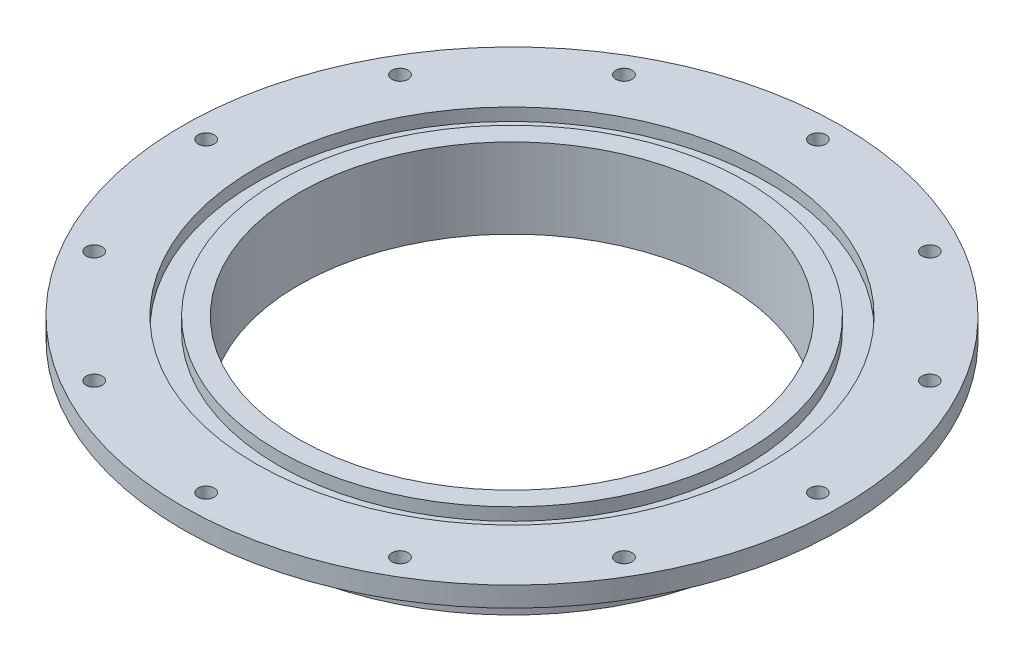
ISO-10303-21;
HEADER;
FILE_DESCRIPTION(('STEP AP214'),'2;1');
FILE_NAME('part.step','',(''),(''),'','','');
FILE_SCHEMA(('AUTOMOTIVE_DESIGN { 1 0 10303 214 1 1 1 1 }'));
ENDSEC;
DATA;
#1=APPLICATION_CONTEXT('core data for automotive mechanical design processes');
#2=APPLICATION_PROTOCOL_DEFINITION('international standard','automotive_design',2000,#1);
#3=PRODUCT_CONTEXT('',#1,'mechanical');
#4=PRODUCT('Part','Part','',(#3));
#5=PRODUCT_RELATED_PRODUCT_CATEGORY('part','',(#4));
#6=PRODUCT_DEFINITION_FORMATION('','',#4);
#7=PRODUCT_DEFINITION_CONTEXT('part definition',#1,'design');
#8=PRODUCT_DEFINITION('design','',#6,#7);
#9=PRODUCT_DEFINITION_SHAPE('','',#8);
#10=(LENGTH_UNIT() NAMED_UNIT(*) SI_UNIT(.MILLI.,.METRE.));
#11=(NAMED_UNIT(*) PLANE_ANGLE_UNIT() SI_UNIT($,.RADIAN.));
#12=(NAMED_UNIT(*) SI_UNIT($,.STERADIAN.) SOLID_ANGLE_UNIT());
#13=UNCERTAINTY_MEASURE_WITH_UNIT(LENGTH_MEASURE(1.E-05),#10,'distance_accuracy_value','');
#14=(GEOMETRIC_REPRESENTATION_CONTEXT(3) GLOBAL_UNCERTAINTY_ASSIGNED_CONTEXT((#13)) GLOBAL_UNIT_ASSIGNED_CONTEXT((#10,
#11,#12)) REPRESENTATION_CONTEXT('',''));
#15=CARTESIAN_POINT('',(0.,0.,0.));
#16=DIRECTION('',(0.,0.,1.));
#17=DIRECTION('',(1.,0.,0.));
#18=AXIS2_PLACEMENT_3D('',#15,#16,#17);
#19=CARTESIAN_POINT('',(0.,19.05,0.));
#20=DIRECTION('',(0.,-1.,0.));
#21=DIRECTION('',(0.,0.,-1.));
#22=AXIS2_PLACEMENT_3D('',#19,#20,#21);
#23=CYLINDRICAL_SURFACE('',#22,80.518);
#24=CARTESIAN_POINT('',(0.,19.05,0.));
#25=DIRECTION('',(0.,1.,0.));
#26=DIRECTION('',(0.,0.,1.));
#27=AXIS2_PLACEMENT_3D('',#24,#25,#26);
#28=CIRCLE('',#27,80.518);
#29=CARTESIAN_POINT('',(0.,19.05,-80.518));
#30=VERTEX_POINT('',#29);
#31=EDGE_CURVE('E10',#30,#30,#28,.T.);
#32=CARTESIAN_POINT('',(0.,13.1318,0.));
#33=DIRECTION('',(0.,-1.,0.));
#34=DIRECTION('',(0.,0.,-1.));
#35=AXIS2_PLACEMENT_3D('',#32,#33,#34);
#36=CIRCLE('',#35,80.518);
#37=CARTESIAN_POINT('',(0.,13.1318,-80.518));
#38=VERTEX_POINT('',#37);
#39=EDGE_CURVE('E189',#38,#38,#36,.T.);
#40=CARTESIAN_POINT('',(0.,19.05,-80.518));
#41=CARTESIAN_POINT('',(0.,18.9883520833333,-80.518));
#42=CARTESIAN_POINT('',(0.,18.9267041666667,-80.518));
#43=CARTESIAN_POINT('',(0.,18.8034083333333,-80.518));
#44=CARTESIAN_POINT('',(0.,18.7417604166667,-80.518));
#45=CARTESIAN_POINT('',(0.,18.6184645833333,-80.518));
#46=CARTESIAN_POINT('',(0.,18.5568166666667,-80.518));
#47=CARTESIAN_POINT('',(0.,18.4335208333333,-80.518));
#48=CARTESIAN_POINT('',(0.,18.3718729166667,-80.518));
#49=CARTESIAN_POINT('',(0.,18.2485770833333,-80.518));
#50=CARTESIAN_POINT('',(0.,18.1869291666667,-80.518));
#51=CARTESIAN_POINT('',(0.,18.0636333333333,-80.518));
#52=CARTESIAN_POINT('',(0.,18.0019854166667,-80.518));
#53=CARTESIAN_POINT('',(0.,17.8786895833333,-80.518));
#54=CARTESIAN_POINT('',(0.,17.8170416666667,-80.518));
#55=CARTESIAN_POINT('',(0.,17.6937458333333,-80.518));
#56=CARTESIAN_POINT('',(0.,17.6320979166667,-80.518));
#57=CARTESIAN_POINT('',(0.,17.5088020833333,-80.518));
#58=CARTESIAN_POINT('',(0.,17.4471541666667,-80.518));
#59=CARTESIAN_POINT('',(0.,17.3238583333333,-80.518));
#60=CARTESIAN_POINT('',(0.,17.2622104166667,-80.518));
#61=CARTESIAN_POINT('',(0.,17.1389145833333,-80.518));
#62=CARTESIAN_POINT('',(0.,17.0772666666667,-80.518));
#63=CARTESIAN_POINT('',(0.,16.9539708333333,-80.518));
#64=CARTESIAN_POINT('',(0.,16.8923229166667,-80.518));
#65=CARTESIAN_POINT('',(0.,16.7690270833333,-80.518));
#66=CARTESIAN_POINT('',(0.,16.7073791666667,-80.518));
#67=CARTESIAN_POINT('',(0.,16.5840833333333,-80.518));
#68=CARTESIAN_POINT('',(0.,16.5224354166667,-80.518));
#69=CARTESIAN_POINT('',(0.,16.3991395833333,-80.518));
#70=CARTESIAN_POINT('',(0.,16.3374916666667,-80.518));
#71=CARTESIAN_POINT('',(0.,16.2141958333333,-80.518));
#72=CARTESIAN_POINT('',(0.,16.1525479166667,-80.518));
#73=CARTESIAN_POINT('',(0.,16.0292520833333,-80.518));
#74=CARTESIAN_POINT('',(0.,15.9676041666667,-80.518));
#75=CARTESIAN_POINT('',(0.,15.8443083333333,-80.518));
#76=CARTESIAN_POINT('',(0.,15.7826604166667,-80.518));
#77=CARTESIAN_POINT('',(0.,15.6593645833333,-80.518));
#78=CARTESIAN_POINT('',(0.,15.5977166666667,-80.518));
#79=CARTESIAN_POINT('',(0.,15.4744208333333,-80.518));
#80=CARTESIAN_POINT('',(0.,15.4127729166667,-80.518));
#81=CARTESIAN_POINT('',(0.,15.2894770833333,-80.518));
#82=CARTESIAN_POINT('',(0.,15.2278291666667,-80.518));
#83=CARTESIAN_POINT('',(0.,15.1045333333333,-80.518));
#84=CARTESIAN_POINT('',(0.,15.0428854166667,-80.518));
#85=CARTESIAN_POINT('',(0.,14.9195895833333,-80.518));
#86=CARTESIAN_POINT('',(0.,14.8579416666667,-80.518));
#87=CARTESIAN_POINT('',(0.,14.7346458333333,-80.518));
#88=CARTESIAN_POINT('',(0.,14.6729979166667,-80.518));
#89=CARTESIAN_POINT('',(0.,14.5497020833333,-80.518));
#90=CARTESIAN_POINT('',(0.,14.4880541666667,-80.518));
#91=CARTESIAN_POINT('',(0.,14.3647583333333,-80.518));
#92=CARTESIAN_POINT('',(0.,14.3031104166667,-80.518));
#93=CARTESIAN_POINT('',(0.,14.1798145833333,-80.518));
#94=CARTESIAN_POINT('',(0.,14.1181666666667,-80.518));
#95=CARTESIAN_POINT('',(0.,13.9948708333333,-80.518));
#96=CARTESIAN_POINT('',(0.,13.9332229166667,-80.518));
#97=CARTESIAN_POINT('',(0.,13.8099270833333,-80.518));
#98=CARTESIAN_POINT('',(0.,13.7482791666667,-80.518));
#99=CARTESIAN_POINT('',(0.,13.6249833333333,-80.518));
#100=CARTESIAN_POINT('',(0.,13.5633354166667,-80.518));
#101=CARTESIAN_POINT('',(0.,13.4400395833333,-80.518));
#102=CARTESIAN_POINT('',(0.,13.3783916666667,-80.518));
#103=CARTESIAN_POINT('',(0.,13.2550958333333,-80.518));
#104=CARTESIAN_POINT('',(0.,13.1934479166667,-80.518));
#105=CARTESIAN_POINT('',(0.,13.1318,-80.518));
#106=B_SPLINE_CURVE_WITH_KNOTS('',3,(#40,#41,#42,#43,#44,#45,#46,#47,#48,#49,#50,#51,#52,#53,
#54,#55,#56,#57,#58,#59,#60,#61,#62,#63,#64,#65,#66,#67,#68,#69,#70,#71,#72,#73,#74,#75,#76,#77,
#78,#79,#80,#81,#82,#83,#84,#85,#86,#87,#88,#89,#90,#91,#92,#93,#94,#95,#96,#97,#98,#99,#100,
#101,#102,#103,#104,#105),.UNSPECIFIED.,.F.,.F.,(4,2,2,2,2,2,2,2,2,2,2,2,2,2,2,2,2,2,2,2,2,2,2,
2,2,2,2,2,2,2,2,2,4),(0.,0.184943750000003,0.369887500000002,0.554831250000002,
0.739775000000002,0.924718750000001,1.1096625,1.29460625,1.47955,1.66449375,1.8494375,
2.03438125,2.219325,2.40426875,2.5892125,2.77415625,2.9591,3.14404375,3.3289875,3.51393125,
3.698875,3.88381875,4.0687625,4.25370625,4.43865,4.62359375,4.8085375,4.99348125,5.178425,
5.36336875,5.5483125,5.73325625,5.9182),.UNSPECIFIED.);
#107=EDGE_CURVE('BSEAM39',#30,#38,#106,.T.);
#108=ORIENTED_EDGE('',*,*,#31,.F.);
#109=ORIENTED_EDGE('',*,*,#39,.F.);
#110=ORIENTED_EDGE('',*,*,#107,.T.);
#111=ORIENTED_EDGE('',*,*,#107,.F.);
#112=EDGE_LOOP('',(#108,#110,#109,#111));
#113=FACE_BOUND('',#112,.T.);
#114=ADVANCED_FACE('F39',(#113),#23,.T.);
#115=CARTESIAN_POINT('',(0.,25.4,0.));
#116=DIRECTION('',(0.,1.,0.));
#117=DIRECTION('',(0.,0.,1.));
#118=AXIS2_PLACEMENT_3D('',#115,#116,#117);
#119=PLANE('',#118);
#120=CARTESIAN_POINT('',(0.,25.4,0.));
#121=DIRECTION('',(0.,1.,0.));
#122=DIRECTION('',(0.,0.,1.));
#123=AXIS2_PLACEMENT_3D('',#120,#121,#122);
#124=CIRCLE('',#123,67.818);
#125=CARTESIAN_POINT('',(0.,25.4,-67.818));
#126=VERTEX_POINT('',#125);
#127=EDGE_CURVE('E62',#126,#126,#124,.T.);
#128=ORIENTED_EDGE('',*,*,#127,.F.);
#129=EDGE_LOOP('',(#128));
#130=FACE_BOUND('',#129,.T.);
#131=CARTESIAN_POINT('',(0.,25.4,0.));
#132=DIRECTION('',(0.,1.,0.));
#133=DIRECTION('',(0.,0.,1.));
#134=AXIS2_PLACEMENT_3D('',#131,#132,#133);
#135=CIRCLE('',#134,74.295);
#136=CARTESIAN_POINT('',(0.,25.4,74.295));
#137=VERTEX_POINT('',#136);
#138=EDGE_CURVE('E78',#137,#137,#135,.T.);
#139=ORIENTED_EDGE('',*,*,#138,.T.);
#140=EDGE_LOOP('',(#139));
#141=FACE_BOUND('',#140,.T.);
#142=ADVANCED_FACE('F207',(#130,#141),#119,.T.);
#143=CARTESIAN_POINT('',(0.,0.,0.));
#144=DIRECTION('',(0.,1.,0.));
#145=DIRECTION('',(0.,0.,1.));
#146=AXIS2_PLACEMENT_3D('',#143,#144,#145);
#147=PLANE('',#146);
#148=CARTESIAN_POINT('',(0.,0.,0.));
#149=DIRECTION('',(0.,1.,0.));
#150=DIRECTION('',(0.,0.,1.));
#151=AXIS2_PLACEMENT_3D('',#148,#149,#150);
#152=CIRCLE('',#151,80.518);
#153=CARTESIAN_POINT('',(0.,0.,-80.518));
#154=VERTEX_POINT('',#153);
#155=EDGE_CURVE('E43',#154,#154,#152,.T.);
#156=ORIENTED_EDGE('',*,*,#155,.F.);
#157=EDGE_LOOP('',(#156));
#158=FACE_BOUND('',#157,.T.);
#159=CARTESIAN_POINT('',(0.,0.,0.));
#160=DIRECTION('',(0.,1.,0.));
#161=DIRECTION('',(0.,0.,1.));
#162=AXIS2_PLACEMENT_3D('',#159,#160,#161);
#163=CIRCLE('',#162,67.818);
#164=CARTESIAN_POINT('',(0.,0.,-67.818));
#165=VERTEX_POINT('',#164);
#166=EDGE_CURVE('E52',#165,#165,#163,.T.);
#167=ORIENTED_EDGE('',*,*,#166,.T.);
#168=EDGE_LOOP('',(#167));
#169=FACE_BOUND('',#168,.T.);
#170=ADVANCED_FACE('F214',(#158,#169),#147,.F.);
#171=CARTESIAN_POINT('',(0.,5.9182,0.));
#172=DIRECTION('',(0.,-1.,0.));
#173=DIRECTION('',(0.,0.,-1.));
#174=AXIS2_PLACEMENT_3D('',#171,#172,#173);
#175=CIRCLE('',#174,80.518);
#176=CARTESIAN_POINT('',(0.,5.9182,-80.518));
#177=VERTEX_POINT('',#176);
#178=EDGE_CURVE('E175',#177,#177,#175,.T.);
#179=CARTESIAN_POINT('',(0.,5.9182,-80.518));
#180=CARTESIAN_POINT('',(0.,5.85655208333333,-80.518));
#181=CARTESIAN_POINT('',(0.,5.79490416666667,-80.518));
#182=CARTESIAN_POINT('',(0.,5.67160833333333,-80.518));
#183=CARTESIAN_POINT('',(0.,5.60996041666667,-80.518));
#184=CARTESIAN_POINT('',(0.,5.48666458333333,-80.518));
#185=CARTESIAN_POINT('',(0.,5.42501666666667,-80.518));
#186=CARTESIAN_POINT('',(0.,5.30172083333333,-80.518));
#187=CARTESIAN_POINT('',(0.,5.24007291666667,-80.518));
#188=CARTESIAN_POINT('',(0.,5.11677708333333,-80.518));
#189=CARTESIAN_POINT('',(0.,5.05512916666667,-80.518));
#190=CARTESIAN_POINT('',(0.,4.93183333333333,-80.518));
#191=CARTESIAN_POINT('',(0.,4.87018541666667,-80.518));
#192=CARTESIAN_POINT('',(0.,4.74688958333333,-80.518));
#193=CARTESIAN_POINT('',(0.,4.68524166666667,-80.518));
#194=CARTESIAN_POINT('',(0.,4.56194583333333,-80.518));
#195=CARTESIAN_POINT('',(0.,4.50029791666667,-80.518));
#196=CARTESIAN_POINT('',(0.,4.37700208333333,-80.518));
#197=CARTESIAN_POINT('',(0.,4.31535416666667,-80.518));
#198=CARTESIAN_POINT('',(0.,4.19205833333333,-80.518));
#199=CARTESIAN_POINT('',(0.,4.13041041666667,-80.518));
#200=CARTESIAN_POINT('',(0.,4.00711458333333,-80.518));
#201=CARTESIAN_POINT('',(0.,3.94546666666667,-80.518));
#202=CARTESIAN_POINT('',(0.,3.82217083333333,-80.518));
#203=CARTESIAN_POINT('',(0.,3.76052291666667,-80.518));
#204=CARTESIAN_POINT('',(0.,3.63722708333333,-80.518));
#205=CARTESIAN_POINT('',(0.,3.57557916666667,-80.518));
#206=CARTESIAN_POINT('',(0.,3.45228333333333,-80.518));
#207=CARTESIAN_POINT('',(0.,3.39063541666667,-80.518));
#208=CARTESIAN_POINT('',(0.,3.26733958333334,-80.518));
#209=CARTESIAN_POINT('',(0.,3.20569166666667,-80.518));
#210=CARTESIAN_POINT('',(0.,3.08239583333333,-80.518));
#211=CARTESIAN_POINT('',(0.,3.02074791666667,-80.518));
#212=CARTESIAN_POINT('',(0.,2.89745208333333,-80.518));
#213=CARTESIAN_POINT('',(0.,2.83580416666667,-80.518));
#214=CARTESIAN_POINT('',(0.,2.71250833333333,-80.518));
#215=CARTESIAN_POINT('',(0.,2.65086041666667,-80.518));
#216=CARTESIAN_POINT('',(0.,2.52756458333333,-80.518));
#217=CARTESIAN_POINT('',(0.,2.46591666666667,-80.518));
#218=CARTESIAN_POINT('',(0.,2.34262083333333,-80.518));
#219=CARTESIAN_POINT('',(0.,2.28097291666667,-80.518));
#220=CARTESIAN_POINT('',(0.,2.15767708333333,-80.518));
#221=CARTESIAN_POINT('',(0.,2.09602916666667,-80.518));
#222=CARTESIAN_POINT('',(0.,1.97273333333334,-80.518));
#223=CARTESIAN_POINT('',(0.,1.91108541666667,-80.518));
#224=CARTESIAN_POINT('',(0.,1.78778958333334,-80.518));
#225=CARTESIAN_POINT('',(0.,1.72614166666667,-80.518));
#226=CARTESIAN_POINT('',(0.,1.60284583333333,-80.518));
#227=CARTESIAN_POINT('',(0.,1.54119791666667,-80.518));
#228=CARTESIAN_POINT('',(0.,1.41790208333333,-80.518));
#229=CARTESIAN_POINT('',(0.,1.35625416666667,-80.518));
#230=CARTESIAN_POINT('',(0.,1.23295833333333,-80.518));
#231=CARTESIAN_POINT('',(0.,1.17131041666667,-80.518));
#232=CARTESIAN_POINT('',(0.,1.04801458333333,-80.518));
#233=CARTESIAN_POINT('',(0.,0.986366666666668,-80.518));
#234=CARTESIAN_POINT('',(0.,0.863070833333333,-80.518));
#235=CARTESIAN_POINT('',(0.,0.801422916666666,-80.518));
#236=CARTESIAN_POINT('',(0.,0.678127083333332,-80.518));
#237=CARTESIAN_POINT('',(0.,0.616479166666665,-80.518));
#238=CARTESIAN_POINT('',(0.,0.493183333333332,-80.518));
#239=CARTESIAN_POINT('',(0.,0.431535416666666,-80.518));
#240=CARTESIAN_POINT('',(0.,0.308239583333333,-80.518));
#241=CARTESIAN_POINT('',(0.,0.246591666666666,-80.518));
#242=CARTESIAN_POINT('',(0.,0.123295833333333,-80.518));
#243=CARTESIAN_POINT('',(0.,0.0616479166666666,-80.518));
#244=CARTESIAN_POINT('',(0.,0.,-80.518));
#245=B_SPLINE_CURVE_WITH_KNOTS('',3,(#179,#180,#181,#182,#183,#184,#185,#186,#187,#188,#189,
#190,#191,#192,#193,#194,#195,#196,#197,#198,#199,#200,#201,#202,#203,#204,#205,#206,#207,#208,
#209,#210,#211,#212,#213,#214,#215,#216,#217,#218,#219,#220,#221,#222,#223,#224,#225,#226,#227,
#228,#229,#230,#231,#232,#233,#234,#235,#236,#237,#238,#239,#240,#241,#242,#243,#244),
.UNSPECIFIED.,.F.,.F.,(4,2,2,2,2,2,2,2,2,2,2,2,2,2,2,2,2,2,2,2,2,2,2,2,2,2,2,2,2,2,2,2,4),(0.,
0.18494375,0.369887500000001,0.55483125,0.739775,0.924718750000001,1.1096625,1.29460625,1.47955,
1.66449375,1.8494375,2.03438125,2.219325,2.40426875,2.5892125,2.77415625,2.9591,3.14404375,
3.3289875,3.51393125,3.698875,3.88381875,4.0687625,4.25370625,4.43865,4.62359375,4.8085375,
4.99348125,5.178425,5.36336875,5.5483125,5.73325625,5.9182),.UNSPECIFIED.);
#246=EDGE_CURVE('BSEAM41',#177,#154,#245,.T.);
#247=ORIENTED_EDGE('',*,*,#178,.T.);
#248=ORIENTED_EDGE('',*,*,#155,.T.);
#249=ORIENTED_EDGE('',*,*,#246,.T.);
#250=ORIENTED_EDGE('',*,*,#246,.F.);
#251=EDGE_LOOP('',(#247,#249,#248,#250));
#252=FACE_BOUND('',#251,.T.);
#253=ADVANCED_FACE('F41',(#252),#23,.T.);
#254=CARTESIAN_POINT('',(0.,19.05,0.));
#255=DIRECTION('',(0.,-1.,0.));
#256=DIRECTION('',(0.,0.,-1.));
#257=AXIS2_PLACEMENT_3D('',#254,#255,#256);
#258=CYLINDRICAL_SURFACE('',#257,67.818);
#259=CARTESIAN_POINT('',(0.,0.,-67.818));
#260=CARTESIAN_POINT('',(0.,0.264583333333333,-67.818));
#261=CARTESIAN_POINT('',(0.,0.529166666666666,-67.818));
#262=CARTESIAN_POINT('',(0.,1.05833333333333,-67.818));
#263=CARTESIAN_POINT('',(0.,1.32291666666667,-67.818));
#264=CARTESIAN_POINT('',(0.,1.85208333333333,-67.818));
#265=CARTESIAN_POINT('',(0.,2.11666666666667,-67.818));
#266=CARTESIAN_POINT('',(0.,2.64583333333333,-67.818));
#267=CARTESIAN_POINT('',(0.,2.91041666666667,-67.818));
#268=CARTESIAN_POINT('',(0.,3.43958333333333,-67.818));
#269=CARTESIAN_POINT('',(0.,3.70416666666667,-67.818));
#270=CARTESIAN_POINT('',(0.,4.23333333333333,-67.818));
#271=CARTESIAN_POINT('',(0.,4.49791666666667,-67.818));
#272=CARTESIAN_POINT('',(0.,5.02708333333333,-67.818));
#273=CARTESIAN_POINT('',(0.,5.29166666666666,-67.818));
#274=CARTESIAN_POINT('',(0.,5.82083333333333,-67.818));
#275=CARTESIAN_POINT('',(0.,6.08541666666666,-67.818));
#276=CARTESIAN_POINT('',(0.,6.61458333333333,-67.818));
#277=CARTESIAN_POINT('',(0.,6.87916666666667,-67.818));
#278=CARTESIAN_POINT('',(0.,7.40833333333333,-67.818));
#279=CARTESIAN_POINT('',(0.,7.67291666666667,-67.818));
#280=CARTESIAN_POINT('',(0.,8.20208333333333,-67.818));
#281=CARTESIAN_POINT('',(0.,8.46666666666666,-67.818));
#282=CARTESIAN_POINT('',(0.,8.99583333333333,-67.818));
#283=CARTESIAN_POINT('',(0.,9.26041666666666,-67.818));
#284=CARTESIAN_POINT('',(0.,9.78958333333333,-67.818));
#285=CARTESIAN_POINT('',(0.,10.0541666666667,-67.818));
#286=CARTESIAN_POINT('',(0.,10.5833333333333,-67.818));
#287=CARTESIAN_POINT('',(0.,10.8479166666667,-67.818));
#288=CARTESIAN_POINT('',(0.,11.3770833333333,-67.818));
#289=CARTESIAN_POINT('',(0.,11.6416666666667,-67.818));
#290=CARTESIAN_POINT('',(0.,12.1708333333333,-67.818));
#291=CARTESIAN_POINT('',(0.,12.4354166666667,-67.818));
#292=CARTESIAN_POINT('',(0.,12.9645833333333,-67.818));
#293=CARTESIAN_POINT('',(0.,13.2291666666667,-67.818));
#294=CARTESIAN_POINT('',(0.,13.7583333333333,-67.818));
#295=CARTESIAN_POINT('',(0.,14.0229166666667,-67.818));
#296=CARTESIAN_POINT('',(0.,14.5520833333333,-67.818));
#297=CARTESIAN_POINT('',(0.,14.8166666666667,-67.818));
#298=CARTESIAN_POINT('',(0.,15.3458333333333,-67.818));
#299=CARTESIAN_POINT('',(0.,15.6104166666667,-67.818));
#300=CARTESIAN_POINT('',(0.,16.1395833333333,-67.818));
#301=CARTESIAN_POINT('',(0.,16.4041666666667,-67.818));
#302=CARTESIAN_POINT('',(0.,16.9333333333333,-67.818));
#303=CARTESIAN_POINT('',(0.,17.1979166666667,-67.818));
#304=CARTESIAN_POINT('',(0.,17.7270833333333,-67.818));
#305=CARTESIAN_POINT('',(0.,17.9916666666667,-67.818));
#306=CARTESIAN_POINT('',(0.,18.5208333333333,-67.818));
#307=CARTESIAN_POINT('',(0.,18.7854166666667,-67.818));
#308=CARTESIAN_POINT('',(0.,19.3145833333333,-67.818));
#309=CARTESIAN_POINT('',(0.,19.5791666666667,-67.818));
#310=CARTESIAN_POINT('',(0.,20.1083333333333,-67.818));
#311=CARTESIAN_POINT('',(0.,20.3729166666667,-67.818));
#312=CARTESIAN_POINT('',(0.,20.9020833333333,-67.818));
#313=CARTESIAN_POINT('',(0.,21.1666666666667,-67.818));
#314=CARTESIAN_POINT('',(0.,21.6958333333333,-67.818));
#315=CARTESIAN_POINT('',(0.,21.9604166666667,-67.818));
#316=CARTESIAN_POINT('',(0.,22.4895833333333,-67.818));
#317=CARTESIAN_POINT('',(0.,22.7541666666667,-67.818));
#318=CARTESIAN_POINT('',(0.,23.2833333333333,-67.818));
#319=CARTESIAN_POINT('',(0.,23.5479166666667,-67.818));
#320=CARTESIAN_POINT('',(0.,24.0770833333333,-67.818));
#321=CARTESIAN_POINT('',(0.,24.3416666666667,-67.818));
#322=CARTESIAN_POINT('',(0.,24.8708333333333,-67.818));
#323=CARTESIAN_POINT('',(0.,25.1354166666667,-67.818));
#324=CARTESIAN_POINT('',(0.,25.4,-67.818));
#325=B_SPLINE_CURVE_WITH_KNOTS('',3,(#259,#260,#261,#262,#263,#264,#265,#266,#267,#268,#269,
#270,#271,#272,#273,#274,#275,#276,#277,#278,#279,#280,#281,#282,#283,#284,#285,#286,#287,#288,
#289,#290,#291,#292,#293,#294,#295,#296,#297,#298,#299,#300,#301,#302,#303,#304,#305,#306,#307,
#308,#309,#310,#311,#312,#313,#314,#315,#316,#317,#318,#319,#320,#321,#322,#323,#324),
.UNSPECIFIED.,.F.,.F.,(4,2,2,2,2,2,2,2,2,2,2,2,2,2,2,2,2,2,2,2,2,2,2,2,2,2,2,2,2,2,2,2,4),(0.,
0.793749999999999,1.5875,2.38125,3.175,3.96875,4.7625,5.55625,6.35,7.14375,7.9375,8.73125,9.525,
10.31875,11.1125,11.90625,12.7,13.49375,14.2875,15.08125,15.875,16.66875,17.4625,18.25625,19.05,
19.84375,20.6375,21.43125,22.225,23.01875,23.8125,24.60625,25.4),.UNSPECIFIED.);
#326=EDGE_CURVE('BSEAM218',#165,#126,#325,.T.);
#327=ORIENTED_EDGE('',*,*,#166,.F.);
#328=ORIENTED_EDGE('',*,*,#127,.T.);
#329=ORIENTED_EDGE('',*,*,#326,.T.);
#330=ORIENTED_EDGE('',*,*,#326,.F.);
#331=EDGE_LOOP('',(#327,#329,#328,#330));
#332=FACE_BOUND('',#331,.T.);
#333=ADVANCED_FACE('F218',(#332),#258,.F.);
#334=CARTESIAN_POINT('',(84.2211870243877,25.4,48.6251249999998));
#335=DIRECTION('',(0.,1.,0.));
#336=DIRECTION('',(0.86602540378444,0.,0.499999999999998));
#337=AXIS2_PLACEMENT_3D('',#334,#335,#336);
#338=CIRCLE('',#337,2.55269999999999);
#339=CARTESIAN_POINT('',(86.4318900726283,25.4,49.9014749999998));
#340=VERTEX_POINT('',#339);
#341=EDGE_CURVE('E156',#340,#340,#338,.T.);
#342=ORIENTED_EDGE('',*,*,#341,.F.);
#343=EDGE_LOOP('',(#342));
#344=FACE_BOUND('',#343,.T.);
#345=CARTESIAN_POINT('',(97.25025,25.4,-3.39547433072829E-13));
#346=DIRECTION('',(0.,1.,0.));
#347=DIRECTION('',(1.,0.,0.));
#348=AXIS2_PLACEMENT_3D('',#345,#346,#347);
#349=CIRCLE('',#348,2.55269999999999);
#350=CARTESIAN_POINT('',(99.80295,25.4,-3.48460137486494E-13));
#351=VERTEX_POINT('',#350);
#352=EDGE_CURVE('E148',#351,#351,#349,.T.);
#353=ORIENTED_EDGE('',*,*,#352,.F.);
#354=EDGE_LOOP('',(#353));
#355=FACE_BOUND('',#354,.T.);
#356=CARTESIAN_POINT('',(84.2211870243874,25.4,-48.6251250000004));
#357=DIRECTION('',(0.,1.,0.));
#358=DIRECTION('',(0.866025403784436,0.,-0.500000000000004));
#359=AXIS2_PLACEMENT_3D('',#356,#357,#358);
#360=CIRCLE('',#359,2.55269999999999);
#361=CARTESIAN_POINT('',(86.4318900726279,25.4,-49.9014750000004));
#362=VERTEX_POINT('',#361);
#363=EDGE_CURVE('E140',#362,#362,#360,.T.);
#364=ORIENTED_EDGE('',*,*,#363,.F.);
#365=EDGE_LOOP('',(#364));
#366=FACE_BOUND('',#365,.T.);
#367=CARTESIAN_POINT('',(48.6251249999995,25.4,-84.2211870243879));
#368=DIRECTION('',(0.,1.,0.));
#369=DIRECTION('',(0.499999999999995,0.,-0.866025403784442));
#370=AXIS2_PLACEMENT_3D('',#367,#368,#369);
#371=CIRCLE('',#370,2.55269999999999);
#372=CARTESIAN_POINT('',(49.9014749999995,25.4,-86.4318900726284));
#373=VERTEX_POINT('',#372);
#374=EDGE_CURVE('E132',#373,#373,#371,.T.);
#375=ORIENTED_EDGE('',*,*,#374,.F.);
#376=EDGE_LOOP('',(#375));
#377=FACE_BOUND('',#376,.T.);
#378=CARTESIAN_POINT('',(0.,25.4,-97.25025));
#379=DIRECTION('',(0.,1.,0.));
#380=DIRECTION('',(0.,0.,-1.));
#381=AXIS2_PLACEMENT_3D('',#378,#379,#380);
#382=CIRCLE('',#381,2.55269999999999);
#383=CARTESIAN_POINT('',(0.,25.4,-99.80295));
#384=VERTEX_POINT('',#383);
#385=EDGE_CURVE('E124',#384,#384,#382,.T.);
#386=ORIENTED_EDGE('',*,*,#385,.F.);
#387=EDGE_LOOP('',(#386));
#388=FACE_BOUND('',#387,.T.);
#389=CARTESIAN_POINT('',(-48.6251250000007,25.4,-84.2211870243872));
#390=DIRECTION('',(0.,1.,0.));
#391=DIRECTION('',(-0.500000000000007,0.,-0.866025403784435));
#392=AXIS2_PLACEMENT_3D('',#389,#390,#391);
#393=CIRCLE('',#392,2.55269999999999);
#394=CARTESIAN_POINT('',(-49.9014750000007,25.4,-86.4318900726277));
#395=VERTEX_POINT('',#394);
#396=EDGE_CURVE('E116',#395,#395,#393,.T.);
#397=ORIENTED_EDGE('',*,*,#396,.F.);
#398=EDGE_LOOP('',(#397));
#399=FACE_BOUND('',#398,.T.);
#400=CARTESIAN_POINT('',(-84.2211870243881,25.4,-48.6251249999992));
#401=DIRECTION('',(0.,1.,0.));
#402=DIRECTION('',(-0.866025403784443,0.,-0.499999999999992));
#403=AXIS2_PLACEMENT_3D('',#400,#401,#402);
#404=CIRCLE('',#403,2.55269999999999);
#405=CARTESIAN_POINT('',(-86.4318900726286,25.4,-49.9014749999992));
#406=VERTEX_POINT('',#405);
#407=EDGE_CURVE('E106',#406,#406,#404,.T.);
#408=ORIENTED_EDGE('',*,*,#407,.F.);
#409=EDGE_LOOP('',(#408));
#410=FACE_BOUND('',#409,.T.);
#411=CARTESIAN_POINT('',(-97.25025,25.4,1.01864229921849E-12));
#412=DIRECTION('',(0.,1.,0.));
#413=DIRECTION('',(-1.,0.,0.));
#414=AXIS2_PLACEMENT_3D('',#411,#412,#413);
#415=CIRCLE('',#414,2.55269999999999);
#416=CARTESIAN_POINT('',(-99.80295,25.4,1.04538041245948E-12));
#417=VERTEX_POINT('',#416);
#418=EDGE_CURVE('E107',#417,#417,#415,.T.);
#419=ORIENTED_EDGE('',*,*,#418,.F.);
#420=EDGE_LOOP('',(#419));
#421=FACE_BOUND('',#420,.T.);
#422=CARTESIAN_POINT('',(-84.221187024387,25.4,48.625125000001));
#423=DIRECTION('',(0.,1.,0.));
#424=DIRECTION('',(-0.866025403784433,0.,0.50000000000001));
#425=AXIS2_PLACEMENT_3D('',#422,#423,#424);
#426=CIRCLE('',#425,2.55269999999999);
#427=CARTESIAN_POINT('',(-86.4318900726276,25.4,49.901475000001));
#428=VERTEX_POINT('',#427);
#429=EDGE_CURVE('E170',#428,#428,#426,.T.);
#430=ORIENTED_EDGE('',*,*,#429,.F.);
#431=EDGE_LOOP('',(#430));
#432=FACE_BOUND('',#431,.T.);
#433=CARTESIAN_POINT('',(-48.6251249999989,25.4,84.2211870243882));
#434=DIRECTION('',(0.,1.,0.));
#435=DIRECTION('',(-0.499999999999989,0.,0.866025403784445));
#436=AXIS2_PLACEMENT_3D('',#433,#434,#435);
#437=CIRCLE('',#436,2.55269999999999);
#438=CARTESIAN_POINT('',(-49.9014749999989,25.4,86.4318900726288));
#439=VERTEX_POINT('',#438);
#440=EDGE_CURVE('E171',#439,#439,#437,.T.);
#441=ORIENTED_EDGE('',*,*,#440,.F.);
#442=EDGE_LOOP('',(#441));
#443=FACE_BOUND('',#442,.T.);
#444=CARTESIAN_POINT('',(48.6251250000001,25.4,84.2211870243875));
#445=DIRECTION('',(0.,1.,0.));
#446=DIRECTION('',(0.500000000000001,0.,0.866025403784438));
#447=AXIS2_PLACEMENT_3D('',#444,#445,#446);
#448=CIRCLE('',#447,2.55269999999999);
#449=CARTESIAN_POINT('',(49.9014750000001,25.4,86.4318900726281));
#450=VERTEX_POINT('',#449);
#451=EDGE_CURVE('E97',#450,#450,#448,.T.);
#452=ORIENTED_EDGE('',*,*,#451,.F.);
#453=EDGE_LOOP('',(#452));
#454=FACE_BOUND('',#453,.T.);
#455=CARTESIAN_POINT('',(0.,25.4,97.25025));
#456=DIRECTION('',(0.,1.,0.));
#457=DIRECTION('',(0.,0.,1.));
#458=AXIS2_PLACEMENT_3D('',#455,#456,#457);
#459=CIRCLE('',#458,2.55269999999999);
#460=CARTESIAN_POINT('',(0.,25.4,99.80295));
#461=VERTEX_POINT('',#460);
#462=EDGE_CURVE('E89',#461,#461,#459,.T.);
#463=ORIENTED_EDGE('',*,*,#462,.F.);
#464=EDGE_LOOP('',(#463));
#465=FACE_BOUND('',#464,.T.);
#466=CARTESIAN_POINT('',(0.,25.4,0.));
#467=DIRECTION('',(0.,1.,0.));
#468=DIRECTION('',(0.,0.,1.));
#469=AXIS2_PLACEMENT_3D('',#466,#467,#468);
#470=CIRCLE('',#469,81.407);
#471=CARTESIAN_POINT('',(0.,25.4,81.407));
#472=VERTEX_POINT('',#471);
#473=EDGE_CURVE('E70',#472,#472,#470,.T.);
#474=ORIENTED_EDGE('',*,*,#473,.F.);
#475=EDGE_LOOP('',(#474));
#476=FACE_BOUND('',#475,.T.);
#477=CARTESIAN_POINT('',(0.,25.4,0.));
#478=DIRECTION('',(0.,1.,0.));
#479=DIRECTION('',(0.,0.,1.));
#480=AXIS2_PLACEMENT_3D('',#477,#478,#479);
#481=CIRCLE('',#480,104.775);
#482=CARTESIAN_POINT('',(0.,25.4,104.775));
#483=VERTEX_POINT('',#482);
#484=EDGE_CURVE('E57',#483,#483,#481,.T.);
#485=ORIENTED_EDGE('',*,*,#484,.T.);
#486=EDGE_LOOP('',(#485));
#487=FACE_BOUND('',#486,.T.);
#488=ADVANCED_FACE('F217',(#344,#355,#366,#377,#388,#399,#410,#421,#432,#443,#454,#465,#476,
#487),#119,.T.);
#489=CARTESIAN_POINT('',(0.,19.05,0.));
#490=DIRECTION('',(0.,1.,0.));
#491=DIRECTION('',(0.,0.,1.));
#492=AXIS2_PLACEMENT_3D('',#489,#490,#491);
#493=PLANE('',#492);
#494=CARTESIAN_POINT('',(84.2211870243877,19.05,48.6251249999998));
#495=DIRECTION('',(0.,1.,0.));
#496=DIRECTION('',(0.,0.,1.));
#497=AXIS2_PLACEMENT_3D('',#494,#495,#496);
#498=CIRCLE('',#497,2.55269999999999);
#499=CARTESIAN_POINT('',(84.2211870243877,19.05,51.1778249999998));
#500=VERTEX_POINT('',#499);
#501=EDGE_CURVE('E101',#500,#500,#498,.F.);
#502=ORIENTED_EDGE('',*,*,#501,.F.);
#503=EDGE_LOOP('',(#502));
#504=FACE_BOUND('',#503,.T.);
#505=CARTESIAN_POINT('',(97.25025,19.05,-3.39547433072829E-13));
#506=DIRECTION('',(0.,1.,0.));
#507=DIRECTION('',(0.,0.,1.));
#508=AXIS2_PLACEMENT_3D('',#505,#506,#507);
#509=CIRCLE('',#508,2.55269999999999);
#510=CARTESIAN_POINT('',(97.25025,19.05,2.55269999999965));
#511=VERTEX_POINT('',#510);
#512=EDGE_CURVE('E152',#511,#511,#509,.F.);
#513=ORIENTED_EDGE('',*,*,#512,.F.);
#514=EDGE_LOOP('',(#513));
#515=FACE_BOUND('',#514,.T.);
#516=CARTESIAN_POINT('',(84.2211870243874,19.05,-48.6251250000004));
#517=DIRECTION('',(0.,1.,0.));
#518=DIRECTION('',(0.,0.,1.));
#519=AXIS2_PLACEMENT_3D('',#516,#517,#518);
#520=CIRCLE('',#519,2.55269999999999);
#521=CARTESIAN_POINT('',(84.2211870243874,19.05,-46.0724250000004));
#522=VERTEX_POINT('',#521);
#523=EDGE_CURVE('E144',#522,#522,#520,.F.);
#524=ORIENTED_EDGE('',*,*,#523,.F.);
#525=EDGE_LOOP('',(#524));
#526=FACE_BOUND('',#525,.T.);
#527=CARTESIAN_POINT('',(48.6251249999995,19.05,-84.2211870243879));
#528=DIRECTION('',(0.,1.,0.));
#529=DIRECTION('',(0.,0.,1.));
#530=AXIS2_PLACEMENT_3D('',#527,#528,#529);
#531=CIRCLE('',#530,2.55269999999999);
#532=CARTESIAN_POINT('',(48.6251249999995,19.05,-81.6684870243879));
#533=VERTEX_POINT('',#532);
#534=EDGE_CURVE('E136',#533,#533,#531,.F.);
#535=ORIENTED_EDGE('',*,*,#534,.F.);
#536=EDGE_LOOP('',(#535));
#537=FACE_BOUND('',#536,.T.);
#538=CARTESIAN_POINT('',(0.,19.05,-97.25025));
#539=DIRECTION('',(0.,1.,0.));
#540=DIRECTION('',(0.,0.,1.));
#541=AXIS2_PLACEMENT_3D('',#538,#539,#540);
#542=CIRCLE('',#541,2.55269999999999);
#543=CARTESIAN_POINT('',(0.,19.05,-94.69755));
#544=VERTEX_POINT('',#543);
#545=EDGE_CURVE('E128',#544,#544,#542,.F.);
#546=ORIENTED_EDGE('',*,*,#545,.F.);
#547=EDGE_LOOP('',(#546));
#548=FACE_BOUND('',#547,.T.);
#549=CARTESIAN_POINT('',(-48.6251250000007,19.05,-84.2211870243872));
#550=DIRECTION('',(0.,1.,0.));
#551=DIRECTION('',(0.,0.,1.));
#552=AXIS2_PLACEMENT_3D('',#549,#550,#551);
#553=CIRCLE('',#552,2.55269999999999);
#554=CARTESIAN_POINT('',(-48.6251250000007,19.05,-81.6684870243872));
#555=VERTEX_POINT('',#554);
#556=EDGE_CURVE('E120',#555,#555,#553,.F.);
#557=ORIENTED_EDGE('',*,*,#556,.F.);
#558=EDGE_LOOP('',(#557));
#559=FACE_BOUND('',#558,.T.);
#560=CARTESIAN_POINT('',(-84.2211870243881,19.05,-48.6251249999992));
#561=DIRECTION('',(0.,1.,0.));
#562=DIRECTION('',(0.,0.,1.));
#563=AXIS2_PLACEMENT_3D('',#560,#561,#562);
#564=CIRCLE('',#563,2.55269999999999);
#565=CARTESIAN_POINT('',(-84.2211870243881,19.05,-46.0724249999992));
#566=VERTEX_POINT('',#565);
#567=EDGE_CURVE('E112',#566,#566,#564,.F.);
#568=ORIENTED_EDGE('',*,*,#567,.F.);
#569=EDGE_LOOP('',(#568));
#570=FACE_BOUND('',#569,.T.);
#571=CARTESIAN_POINT('',(-97.25025,19.05,1.01864229921849E-12));
#572=DIRECTION('',(0.,1.,0.));
#573=DIRECTION('',(0.,0.,1.));
#574=AXIS2_PLACEMENT_3D('',#571,#572,#573);
#575=CIRCLE('',#574,2.55269999999999);
#576=CARTESIAN_POINT('',(-97.25025,19.05,2.55270000000101));
#577=VERTEX_POINT('',#576);
#578=EDGE_CURVE('E102',#577,#577,#575,.F.);
#579=ORIENTED_EDGE('',*,*,#578,.F.);
#580=EDGE_LOOP('',(#579));
#581=FACE_BOUND('',#580,.T.);
#582=CARTESIAN_POINT('',(-84.221187024387,19.05,48.625125000001));
#583=DIRECTION('',(0.,1.,0.));
#584=DIRECTION('',(0.,0.,1.));
#585=AXIS2_PLACEMENT_3D('',#582,#583,#584);
#586=CIRCLE('',#585,2.55269999999999);
#587=CARTESIAN_POINT('',(-84.221187024387,19.05,51.177825000001));
#588=VERTEX_POINT('',#587);
#589=EDGE_CURVE('E111',#588,#588,#586,.F.);
#590=ORIENTED_EDGE('',*,*,#589,.F.);
#591=EDGE_LOOP('',(#590));
#592=FACE_BOUND('',#591,.T.);
#593=CARTESIAN_POINT('',(-48.6251249999989,19.05,84.2211870243882));
#594=DIRECTION('',(0.,1.,0.));
#595=DIRECTION('',(0.,0.,1.));
#596=AXIS2_PLACEMENT_3D('',#593,#594,#595);
#597=CIRCLE('',#596,2.55269999999999);
#598=CARTESIAN_POINT('',(-48.6251249999989,19.05,86.7738870243882));
#599=VERTEX_POINT('',#598);
#600=EDGE_CURVE('E166',#599,#599,#597,.F.);
#601=ORIENTED_EDGE('',*,*,#600,.F.);
#602=EDGE_LOOP('',(#601));
#603=FACE_BOUND('',#602,.T.);
#604=CARTESIAN_POINT('',(48.6251250000001,19.05,84.2211870243875));
#605=DIRECTION('',(0.,1.,0.));
#606=DIRECTION('',(0.,0.,1.));
#607=AXIS2_PLACEMENT_3D('',#604,#605,#606);
#608=CIRCLE('',#607,2.55269999999999);
#609=CARTESIAN_POINT('',(48.6251250000001,19.05,86.7738870243875));
#610=VERTEX_POINT('',#609);
#611=EDGE_CURVE('E93',#610,#610,#608,.F.);
#612=ORIENTED_EDGE('',*,*,#611,.F.);
#613=EDGE_LOOP('',(#612));
#614=FACE_BOUND('',#613,.T.);
#615=CARTESIAN_POINT('',(0.,19.05,97.25025));
#616=DIRECTION('',(0.,1.,0.));
#617=DIRECTION('',(0.,0.,1.));
#618=AXIS2_PLACEMENT_3D('',#615,#616,#617);
#619=CIRCLE('',#618,2.55269999999999);
#620=CARTESIAN_POINT('',(0.,19.05,99.80295));
#621=VERTEX_POINT('',#620);
#622=EDGE_CURVE('E82',#621,#621,#619,.F.);
#623=ORIENTED_EDGE('',*,*,#622,.F.);
#624=EDGE_LOOP('',(#623));
#625=FACE_BOUND('',#624,.T.);
#626=ORIENTED_EDGE('',*,*,#31,.T.);
#627=EDGE_LOOP('',(#626));
#628=FACE_BOUND('',#627,.T.);
#629=CARTESIAN_POINT('',(0.,19.05,0.));
#630=DIRECTION('',(0.,1.,0.));
#631=DIRECTION('',(0.,0.,1.));
#632=AXIS2_PLACEMENT_3D('',#629,#630,#631);
#633=CIRCLE('',#632,104.775);
#634=CARTESIAN_POINT('',(0.,19.05,104.775));
#635=VERTEX_POINT('',#634);
#636=EDGE_CURVE('E58',#635,#635,#633,.T.);
#637=ORIENTED_EDGE('',*,*,#636,.F.);
#638=EDGE_LOOP('',(#637));
#639=FACE_BOUND('',#638,.T.);
#640=ADVANCED_FACE('F261',(#504,#515,#526,#537,#548,#559,#570,#581,#592,#603,#614,#625,#628,
#639),#493,.F.);
#641=CARTESIAN_POINT('',(0.,25.4,0.));
#642=DIRECTION('',(0.,-1.,0.));
#643=DIRECTION('',(0.,0.,-1.));
#644=AXIS2_PLACEMENT_3D('',#641,#642,#643);
#645=CYLINDRICAL_SURFACE('',#644,104.775);
#646=ORIENTED_EDGE('',*,*,#484,.F.);
#647=EDGE_LOOP('',(#646));
#648=FACE_BOUND('',#647,.T.);
#649=ORIENTED_EDGE('',*,*,#636,.T.);
#650=EDGE_LOOP('',(#649));
#651=FACE_BOUND('',#650,.T.);
#652=ADVANCED_FACE('F257',(#648,#651),#645,.T.);
#653=CARTESIAN_POINT('',(0.,21.4122,0.));
#654=DIRECTION('',(0.,1.,0.));
#655=DIRECTION('',(0.,0.,1.));
#656=AXIS2_PLACEMENT_3D('',#653,#654,#655);
#657=CYLINDRICAL_SURFACE('',#656,81.407);
#658=CARTESIAN_POINT('',(0.,21.4122,0.));
#659=DIRECTION('',(0.,1.,0.));
#660=DIRECTION('',(0.,0.,1.));
#661=AXIS2_PLACEMENT_3D('',#658,#659,#660);
#662=CIRCLE('',#661,81.407);
#663=CARTESIAN_POINT('',(0.,21.4122,81.407));
#664=VERTEX_POINT('',#663);
#665=EDGE_CURVE('E69',#664,#664,#662,.T.);
#666=ORIENTED_EDGE('',*,*,#665,.F.);
#667=EDGE_LOOP('',(#666));
#668=FACE_BOUND('',#667,.T.);
#669=ORIENTED_EDGE('',*,*,#473,.T.);
#670=EDGE_LOOP('',(#669));
#671=FACE_BOUND('',#670,.T.);
#672=ADVANCED_FACE('F251',(#668,#671),#657,.F.);
#673=CARTESIAN_POINT('',(0.,21.4122,0.));
#674=DIRECTION('',(0.,1.,0.));
#675=DIRECTION('',(0.,0.,1.));
#676=AXIS2_PLACEMENT_3D('',#673,#674,#675);
#677=PLANE('',#676);
#678=CARTESIAN_POINT('',(0.,21.4122,0.));
#679=DIRECTION('',(0.,1.,0.));
#680=DIRECTION('',(0.,0.,1.));
#681=AXIS2_PLACEMENT_3D('',#678,#679,#680);
#682=CIRCLE('',#681,74.295);
#683=CARTESIAN_POINT('',(0.,21.4122,74.295));
#684=VERTEX_POINT('',#683);
#685=EDGE_CURVE('E74',#684,#684,#682,.T.);
#686=ORIENTED_EDGE('',*,*,#685,.F.);
#687=EDGE_LOOP('',(#686));
#688=FACE_BOUND('',#687,.T.);
#689=ORIENTED_EDGE('',*,*,#665,.T.);
#690=EDGE_LOOP('',(#689));
#691=FACE_BOUND('',#690,.T.);
#692=ADVANCED_FACE('F241',(#688,#691),#677,.T.);
#693=CARTESIAN_POINT('',(0.,21.4122,0.));
#694=DIRECTION('',(0.,1.,0.));
#695=DIRECTION('',(0.,0.,1.));
#696=AXIS2_PLACEMENT_3D('',#693,#694,#695);
#697=CYLINDRICAL_SURFACE('',#696,74.295);
#698=ORIENTED_EDGE('',*,*,#685,.T.);
#699=EDGE_LOOP('',(#698));
#700=FACE_BOUND('',#699,.T.);
#701=ORIENTED_EDGE('',*,*,#138,.F.);
#702=EDGE_LOOP('',(#701));
#703=FACE_BOUND('',#702,.T.);
#704=ADVANCED_FACE('F238',(#700,#703),#697,.T.);
#705=CARTESIAN_POINT('',(0.,11.8298740786604,97.25025));
#706=DIRECTION('',(0.,1.,0.));
#707=DIRECTION('',(0.,0.,1.));
#708=AXIS2_PLACEMENT_3D('',#705,#706,#707);
#709=CYLINDRICAL_SURFACE('',#708,2.55269999999999);
#710=ORIENTED_EDGE('',*,*,#622,.T.);
#711=EDGE_LOOP('',(#710));
#712=FACE_BOUND('',#711,.T.);
#713=ORIENTED_EDGE('',*,*,#462,.T.);
#714=EDGE_LOOP('',(#713));
#715=FACE_BOUND('',#714,.T.);
#716=ADVANCED_FACE('F240',(#712,#715),#709,.F.);
#717=CARTESIAN_POINT('',(48.6251250000001,11.8298740786604,84.2211870243875));
#718=DIRECTION('',(0.,1.,0.));
#719=DIRECTION('',(0.,0.,1.));
#720=AXIS2_PLACEMENT_3D('',#717,#718,#719);
#721=CYLINDRICAL_SURFACE('',#720,2.55269999999999);
#722=ORIENTED_EDGE('',*,*,#611,.T.);
#723=EDGE_LOOP('',(#722));
#724=FACE_BOUND('',#723,.T.);
#725=ORIENTED_EDGE('',*,*,#451,.T.);
#726=EDGE_LOOP('',(#725));
#727=FACE_BOUND('',#726,.T.);
#728=ADVANCED_FACE('F248',(#724,#727),#721,.F.);
#729=CARTESIAN_POINT('',(-48.6251249999989,11.8298740786604,84.2211870243882));
#730=DIRECTION('',(0.,1.,0.));
#731=DIRECTION('',(0.,0.,1.));
#732=AXIS2_PLACEMENT_3D('',#729,#730,#731);
#733=CYLINDRICAL_SURFACE('',#732,2.55269999999999);
#734=ORIENTED_EDGE('',*,*,#600,.T.);
#735=EDGE_LOOP('',(#734));
#736=FACE_BOUND('',#735,.T.);
#737=ORIENTED_EDGE('',*,*,#440,.T.);
#738=EDGE_LOOP('',(#737));
#739=FACE_BOUND('',#738,.T.);
#740=ADVANCED_FACE('F317',(#736,#739),#733,.F.);
#741=CARTESIAN_POINT('',(-84.221187024387,11.8298740786604,48.625125000001));
#742=DIRECTION('',(0.,1.,0.));
#743=DIRECTION('',(0.,0.,1.));
#744=AXIS2_PLACEMENT_3D('',#741,#742,#743);
#745=CYLINDRICAL_SURFACE('',#744,2.55269999999999);
#746=ORIENTED_EDGE('',*,*,#589,.T.);
#747=EDGE_LOOP('',(#746));
#748=FACE_BOUND('',#747,.T.);
#749=ORIENTED_EDGE('',*,*,#429,.T.);
#750=EDGE_LOOP('',(#749));
#751=FACE_BOUND('',#750,.T.);
#752=ADVANCED_FACE('F326',(#748,#751),#745,.F.);
#753=CARTESIAN_POINT('',(-97.25025,11.8298740786604,1.01864229921849E-12));
#754=DIRECTION('',(0.,1.,0.));
#755=DIRECTION('',(0.,0.,1.));
#756=AXIS2_PLACEMENT_3D('',#753,#754,#755);
#757=CYLINDRICAL_SURFACE('',#756,2.55269999999999);
#758=ORIENTED_EDGE('',*,*,#578,.T.);
#759=EDGE_LOOP('',(#758));
#760=FACE_BOUND('',#759,.T.);
#761=ORIENTED_EDGE('',*,*,#418,.T.);
#762=EDGE_LOOP('',(#761));
#763=FACE_BOUND('',#762,.T.);
#764=ADVANCED_FACE('F336',(#760,#763),#757,.F.);
#765=CARTESIAN_POINT('',(-84.2211870243881,11.8298740786604,-48.6251249999992));
#766=DIRECTION('',(0.,1.,0.));
#767=DIRECTION('',(0.,0.,1.));
#768=AXIS2_PLACEMENT_3D('',#765,#766,#767);
#769=CYLINDRICAL_SURFACE('',#768,2.55269999999999);
#770=ORIENTED_EDGE('',*,*,#567,.T.);
#771=EDGE_LOOP('',(#770));
#772=FACE_BOUND('',#771,.T.);
#773=ORIENTED_EDGE('',*,*,#407,.T.);
#774=EDGE_LOOP('',(#773));
#775=FACE_BOUND('',#774,.T.);
#776=ADVANCED_FACE('F346',(#772,#775),#769,.F.);
#777=CARTESIAN_POINT('',(-48.6251250000007,11.8298740786604,-84.2211870243872));
#778=DIRECTION('',(0.,1.,0.));
#779=DIRECTION('',(0.,0.,1.));
#780=AXIS2_PLACEMENT_3D('',#777,#778,#779);
#781=CYLINDRICAL_SURFACE('',#780,2.55269999999999);
#782=ORIENTED_EDGE('',*,*,#556,.T.);
#783=EDGE_LOOP('',(#782));
#784=FACE_BOUND('',#783,.T.);
#785=ORIENTED_EDGE('',*,*,#396,.T.);
#786=EDGE_LOOP('',(#785));
#787=FACE_BOUND('',#786,.T.);
#788=ADVANCED_FACE('F356',(#784,#787),#781,.F.);
#789=CARTESIAN_POINT('',(0.,11.8298740786604,-97.25025));
#790=DIRECTION('',(0.,1.,0.));
#791=DIRECTION('',(0.,0.,1.));
#792=AXIS2_PLACEMENT_3D('',#789,#790,#791);
#793=CYLINDRICAL_SURFACE('',#792,2.55269999999999);
#794=ORIENTED_EDGE('',*,*,#545,.T.);
#795=EDGE_LOOP('',(#794));
#796=FACE_BOUND('',#795,.T.);
#797=ORIENTED_EDGE('',*,*,#385,.T.);
#798=EDGE_LOOP('',(#797));
#799=FACE_BOUND('',#798,.T.);
#800=ADVANCED_FACE('F366',(#796,#799),#793,.F.);
#801=CARTESIAN_POINT('',(48.6251249999995,11.8298740786604,-84.2211870243879));
#802=DIRECTION('',(0.,1.,0.));
#803=DIRECTION('',(0.,0.,1.));
#804=AXIS2_PLACEMENT_3D('',#801,#802,#803);
#805=CYLINDRICAL_SURFACE('',#804,2.55269999999999);
#806=ORIENTED_EDGE('',*,*,#534,.T.);
#807=EDGE_LOOP('',(#806));
#808=FACE_BOUND('',#807,.T.);
#809=ORIENTED_EDGE('',*,*,#374,.T.);
#810=EDGE_LOOP('',(#809));
#811=FACE_BOUND('',#810,.T.);
#812=ADVANCED_FACE('F376',(#808,#811),#805,.F.);
#813=CARTESIAN_POINT('',(84.2211870243874,11.8298740786604,-48.6251250000004));
#814=DIRECTION('',(0.,1.,0.));
#815=DIRECTION('',(0.,0.,1.));
#816=AXIS2_PLACEMENT_3D('',#813,#814,#815);
#817=CYLINDRICAL_SURFACE('',#816,2.55269999999999);
#818=ORIENTED_EDGE('',*,*,#523,.T.);
#819=EDGE_LOOP('',(#818));
#820=FACE_BOUND('',#819,.T.);
#821=ORIENTED_EDGE('',*,*,#363,.T.);
#822=EDGE_LOOP('',(#821));
#823=FACE_BOUND('',#822,.T.);
#824=ADVANCED_FACE('F386',(#820,#823),#817,.F.);
#825=CARTESIAN_POINT('',(97.25025,11.8298740786604,-3.39547433072829E-13));
#826=DIRECTION('',(0.,1.,0.));
#827=DIRECTION('',(0.,0.,1.));
#828=AXIS2_PLACEMENT_3D('',#825,#826,#827);
#829=CYLINDRICAL_SURFACE('',#828,2.55269999999999);
#830=ORIENTED_EDGE('',*,*,#512,.T.);
#831=EDGE_LOOP('',(#830));
#832=FACE_BOUND('',#831,.T.);
#833=ORIENTED_EDGE('',*,*,#352,.T.);
#834=EDGE_LOOP('',(#833));
#835=FACE_BOUND('',#834,.T.);
#836=ADVANCED_FACE('F396',(#832,#835),#829,.F.);
#837=CARTESIAN_POINT('',(84.2211870243877,11.8298740786604,48.6251249999998));
#838=DIRECTION('',(0.,1.,0.));
#839=DIRECTION('',(0.,0.,1.));
#840=AXIS2_PLACEMENT_3D('',#837,#838,#839);
#841=CYLINDRICAL_SURFACE('',#840,2.55269999999999);
#842=ORIENTED_EDGE('',*,*,#501,.T.);
#843=EDGE_LOOP('',(#842));
#844=FACE_BOUND('',#843,.T.);
#845=ORIENTED_EDGE('',*,*,#341,.T.);
#846=EDGE_LOOP('',(#845));
#847=FACE_BOUND('',#846,.T.);
#848=ADVANCED_FACE('F405',(#844,#847),#841,.F.);
#849=CARTESIAN_POINT('',(0.,5.9182,0.));
#850=DIRECTION('',(0.,-1.,0.));
#851=DIRECTION('',(0.,0.,-1.));
#852=AXIS2_PLACEMENT_3D('',#849,#850,#851);
#853=PLANE('',#852);
#854=ORIENTED_EDGE('',*,*,#178,.F.);
#855=EDGE_LOOP('',(#854));
#856=FACE_BOUND('',#855,.T.);
#857=CARTESIAN_POINT('',(0.,5.9182,0.));
#858=DIRECTION('',(0.,-1.,0.));
#859=DIRECTION('',(0.,0.,-1.));
#860=AXIS2_PLACEMENT_3D('',#857,#858,#859);
#861=CIRCLE('',#860,76.1746);
#862=CARTESIAN_POINT('',(0.,5.9182,-76.1746));
#863=VERTEX_POINT('',#862);
#864=EDGE_CURVE('E185',#863,#863,#861,.T.);
#865=ORIENTED_EDGE('',*,*,#864,.T.);
#866=EDGE_LOOP('',(#865));
#867=FACE_BOUND('',#866,.T.);
#868=ADVANCED_FACE('F414',(#856,#867),#853,.F.);
#869=CARTESIAN_POINT('',(0.,5.9182,0.));
#870=DIRECTION('',(0.,1.,0.));
#871=DIRECTION('',(0.,0.,1.));
#872=AXIS2_PLACEMENT_3D('',#869,#870,#871);
#873=CYLINDRICAL_SURFACE('',#872,76.1746);
#874=ORIENTED_EDGE('',*,*,#864,.F.);
#875=EDGE_LOOP('',(#874));
#876=FACE_BOUND('',#875,.T.);
#877=CARTESIAN_POINT('',(0.,13.1318,0.));
#878=DIRECTION('',(0.,-1.,0.));
#879=DIRECTION('',(0.,0.,-1.));
#880=AXIS2_PLACEMENT_3D('',#877,#878,#879);
#881=CIRCLE('',#880,76.1746);
#882=CARTESIAN_POINT('',(0.,13.1318,-76.1746));
#883=VERTEX_POINT('',#882);
#884=EDGE_CURVE('E193',#883,#883,#881,.T.);
#885=ORIENTED_EDGE('',*,*,#884,.T.);
#886=EDGE_LOOP('',(#885));
#887=FACE_BOUND('',#886,.T.);
#888=ADVANCED_FACE('F198',(#876,#887),#873,.T.);
#889=CARTESIAN_POINT('',(0.,13.1318,0.));
#890=DIRECTION('',(0.,-1.,0.));
#891=DIRECTION('',(0.,0.,-1.));
#892=AXIS2_PLACEMENT_3D('',#889,#890,#891);
#893=PLANE('',#892);
#894=ORIENTED_EDGE('',*,*,#884,.F.);
#895=EDGE_LOOP('',(#894));
#896=FACE_BOUND('',#895,.T.);
#897=ORIENTED_EDGE('',*,*,#39,.T.);
#898=EDGE_LOOP('',(#897));
#899=FACE_BOUND('',#898,.T.);
#900=ADVANCED_FACE('F200',(#896,#899),#893,.T.);
#901=CLOSED_SHELL('',(#114,#142,#170,#253,#333,#488,#640,#652,#672,#692,#704,#716,#728,#740,
#752,#764,#776,#788,#800,#812,#824,#836,#848,#868,#888,#900));
#902=MANIFOLD_SOLID_BREP('B2',#901);
#903=ADVANCED_BREP_SHAPE_REPRESENTATION('',(#18,#902),#14);
#904=SHAPE_DEFINITION_REPRESENTATION(#9,#903);
ENDSEC;
END-ISO-10303-21;
